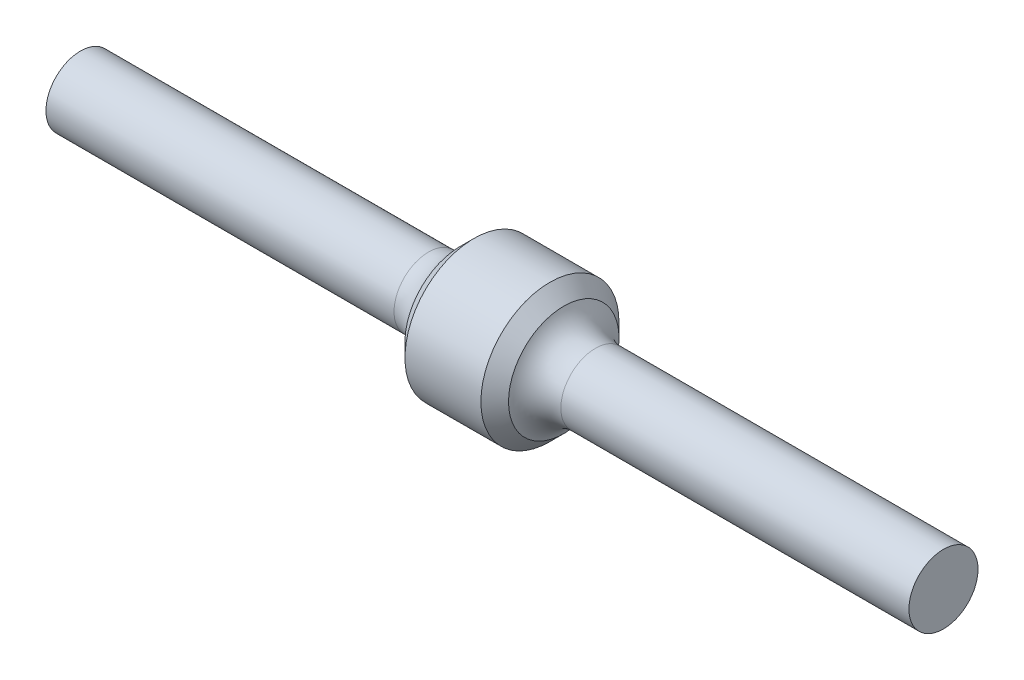
ISO-10303-21;
HEADER;
FILE_DESCRIPTION(('STEP AP214'),'2;1');
FILE_NAME('part.step','',(''),(''),'','','');
FILE_SCHEMA(('AUTOMOTIVE_DESIGN { 1 0 10303 214 1 1 1 1 }'));
ENDSEC;
DATA;
#1=APPLICATION_CONTEXT('core data for automotive mechanical design processes');
#2=APPLICATION_PROTOCOL_DEFINITION('international standard','automotive_design',2000,#1);
#3=PRODUCT_CONTEXT('',#1,'mechanical');
#4=PRODUCT('Part','Part','',(#3));
#5=PRODUCT_RELATED_PRODUCT_CATEGORY('part','',(#4));
#6=PRODUCT_DEFINITION_FORMATION('','',#4);
#7=PRODUCT_DEFINITION_CONTEXT('part definition',#1,'design');
#8=PRODUCT_DEFINITION('design','',#6,#7);
#9=PRODUCT_DEFINITION_SHAPE('','',#8);
#10=(LENGTH_UNIT() NAMED_UNIT(*) SI_UNIT(.MILLI.,.METRE.));
#11=(NAMED_UNIT(*) PLANE_ANGLE_UNIT() SI_UNIT($,.RADIAN.));
#12=(NAMED_UNIT(*) SI_UNIT($,.STERADIAN.) SOLID_ANGLE_UNIT());
#13=UNCERTAINTY_MEASURE_WITH_UNIT(LENGTH_MEASURE(1.E-05),#10,'distance_accuracy_value','');
#14=(GEOMETRIC_REPRESENTATION_CONTEXT(3) GLOBAL_UNCERTAINTY_ASSIGNED_CONTEXT((#13)) GLOBAL_UNIT_ASSIGNED_CONTEXT((#10,
#11,#12)) REPRESENTATION_CONTEXT('',''));
#15=CARTESIAN_POINT('',(0.,0.,0.));
#16=DIRECTION('',(0.,0.,1.));
#17=DIRECTION('',(1.,0.,0.));
#18=AXIS2_PLACEMENT_3D('',#15,#16,#17);
#19=CARTESIAN_POINT('',(-62.5,0.,0.));
#20=DIRECTION('',(1.,0.,0.));
#21=DIRECTION('',(0.,0.,-1.));
#22=AXIS2_PLACEMENT_3D('',#19,#20,#21);
#23=PLANE('',#22);
#24=CARTESIAN_POINT('',(-62.5,0.,0.));
#25=DIRECTION('',(1.,0.,0.));
#26=DIRECTION('',(0.,0.,-1.));
#27=AXIS2_PLACEMENT_3D('',#24,#25,#26);
#28=CIRCLE('',#27,5.);
#29=CARTESIAN_POINT('',(-62.5,0.,-5.));
#30=VERTEX_POINT('',#29);
#31=EDGE_CURVE('E51',#30,#30,#28,.T.);
#32=ORIENTED_EDGE('',*,*,#31,.F.);
#33=EDGE_LOOP('',(#32));
#34=FACE_BOUND('',#33,.T.);
#35=ADVANCED_FACE('F30',(#34),#23,.F.);
#36=CARTESIAN_POINT('',(62.5,0.,0.));
#37=DIRECTION('',(-1.,0.,0.));
#38=DIRECTION('',(0.,0.,1.));
#39=AXIS2_PLACEMENT_3D('',#36,#37,#38);
#40=CYLINDRICAL_SURFACE('',#39,5.);
#41=CARTESIAN_POINT('',(-12.0825756949558,0.,0.));
#42=DIRECTION('',(1.,0.,0.));
#43=DIRECTION('',(0.,0.,-1.));
#44=AXIS2_PLACEMENT_3D('',#41,#42,#43);
#45=CIRCLE('',#44,5.);
#46=CARTESIAN_POINT('',(-12.0825756949558,0.,-5.));
#47=VERTEX_POINT('',#46);
#48=EDGE_CURVE('E45',#47,#47,#45,.F.);
#49=ORIENTED_EDGE('',*,*,#48,.T.);
#50=EDGE_LOOP('',(#49));
#51=FACE_BOUND('',#50,.T.);
#52=ORIENTED_EDGE('',*,*,#31,.T.);
#53=EDGE_LOOP('',(#52));
#54=FACE_BOUND('',#53,.T.);
#55=ADVANCED_FACE('F74',(#51,#54),#40,.T.);
#56=CARTESIAN_POINT('',(-12.0825756949558,0.,0.));
#57=DIRECTION('',(1.,0.,0.));
#58=DIRECTION('',(0.,0.,-1.));
#59=AXIS2_PLACEMENT_3D('',#56,#57,#58);
#60=TOROIDAL_SURFACE('',#59,10.,5.);
#61=ORIENTED_EDGE('',*,*,#48,.F.);
#62=EDGE_LOOP('',(#61));
#63=FACE_BOUND('',#62,.T.);
#64=CARTESIAN_POINT('',(-7.5,0.,0.));
#65=DIRECTION('',(1.,0.,0.));
#66=DIRECTION('',(0.,0.,-1.));
#67=AXIS2_PLACEMENT_3D('',#64,#65,#66);
#68=CIRCLE('',#67,8.);
#69=CARTESIAN_POINT('',(-7.5,0.,-8.));
#70=VERTEX_POINT('',#69);
#71=EDGE_CURVE('E54',#70,#70,#68,.T.);
#72=ORIENTED_EDGE('',*,*,#71,.F.);
#73=EDGE_LOOP('',(#72));
#74=FACE_BOUND('',#73,.T.);
#75=ADVANCED_FACE('F80',(#63,#74),#60,.F.);
#76=CARTESIAN_POINT('',(7.5,0.,0.));
#77=DIRECTION('',(-1.,0.,0.));
#78=DIRECTION('',(0.,0.,1.));
#79=AXIS2_PLACEMENT_3D('',#76,#77,#78);
#80=CYLINDRICAL_SURFACE('',#79,10.);
#81=CARTESIAN_POINT('',(-5.49999999999999,0.,0.));
#82=DIRECTION('',(1.,0.,0.));
#83=DIRECTION('',(0.,0.,-1.));
#84=AXIS2_PLACEMENT_3D('',#81,#82,#83);
#85=CIRCLE('',#84,10.);
#86=CARTESIAN_POINT('',(-5.49999999999999,0.,-10.));
#87=VERTEX_POINT('',#86);
#88=EDGE_CURVE('E10',#87,#87,#85,.T.);
#89=ORIENTED_EDGE('',*,*,#88,.T.);
#90=EDGE_LOOP('',(#89));
#91=FACE_BOUND('',#90,.T.);
#92=CARTESIAN_POINT('',(5.5,0.,0.));
#93=DIRECTION('',(1.,0.,0.));
#94=DIRECTION('',(0.,0.,-1.));
#95=AXIS2_PLACEMENT_3D('',#92,#93,#94);
#96=CIRCLE('',#95,10.);
#97=CARTESIAN_POINT('',(5.5,0.,-10.));
#98=VERTEX_POINT('',#97);
#99=EDGE_CURVE('E37',#98,#98,#96,.F.);
#100=ORIENTED_EDGE('',*,*,#99,.T.);
#101=EDGE_LOOP('',(#100));
#102=FACE_BOUND('',#101,.T.);
#103=ADVANCED_FACE('F93',(#91,#102),#80,.T.);
#104=CARTESIAN_POINT('',(62.5,0.,0.));
#105=DIRECTION('',(1.,0.,0.));
#106=DIRECTION('',(0.,0.,-1.));
#107=AXIS2_PLACEMENT_3D('',#104,#105,#106);
#108=PLANE('',#107);
#109=CARTESIAN_POINT('',(62.5,0.,0.));
#110=DIRECTION('',(1.,0.,0.));
#111=DIRECTION('',(0.,0.,-1.));
#112=AXIS2_PLACEMENT_3D('',#109,#110,#111);
#113=CIRCLE('',#112,5.);
#114=CARTESIAN_POINT('',(62.5,0.,-5.));
#115=VERTEX_POINT('',#114);
#116=EDGE_CURVE('E50',#115,#115,#113,.T.);
#117=ORIENTED_EDGE('',*,*,#116,.T.);
#118=EDGE_LOOP('',(#117));
#119=FACE_BOUND('',#118,.T.);
#120=ADVANCED_FACE('F86',(#119),#108,.T.);
#121=CARTESIAN_POINT('',(12.0825756949558,0.,0.));
#122=DIRECTION('',(-1.,0.,0.));
#123=DIRECTION('',(0.,0.,1.));
#124=AXIS2_PLACEMENT_3D('',#121,#122,#123);
#125=CIRCLE('',#124,5.);
#126=CARTESIAN_POINT('',(12.0825756949558,0.,5.));
#127=VERTEX_POINT('',#126);
#128=EDGE_CURVE('E41',#127,#127,#125,.F.);
#129=ORIENTED_EDGE('',*,*,#128,.T.);
#130=EDGE_LOOP('',(#129));
#131=FACE_BOUND('',#130,.T.);
#132=ORIENTED_EDGE('',*,*,#116,.F.);
#133=EDGE_LOOP('',(#132));
#134=FACE_BOUND('',#133,.T.);
#135=ADVANCED_FACE('F83',(#131,#134),#40,.T.);
#136=CARTESIAN_POINT('',(12.0825756949558,0.,0.));
#137=DIRECTION('',(-1.,0.,0.));
#138=DIRECTION('',(0.,0.,1.));
#139=AXIS2_PLACEMENT_3D('',#136,#137,#138);
#140=TOROIDAL_SURFACE('',#139,10.,5.);
#141=CARTESIAN_POINT('',(7.5,0.,0.));
#142=DIRECTION('',(-1.,0.,0.));
#143=DIRECTION('',(0.,0.,1.));
#144=AXIS2_PLACEMENT_3D('',#141,#142,#143);
#145=CIRCLE('',#144,8.);
#146=CARTESIAN_POINT('',(7.5,0.,8.));
#147=VERTEX_POINT('',#146);
#148=EDGE_CURVE('E59',#147,#147,#145,.F.);
#149=ORIENTED_EDGE('',*,*,#148,.T.);
#150=EDGE_LOOP('',(#149));
#151=FACE_BOUND('',#150,.T.);
#152=ORIENTED_EDGE('',*,*,#128,.F.);
#153=EDGE_LOOP('',(#152));
#154=FACE_BOUND('',#153,.T.);
#155=ADVANCED_FACE('F63',(#151,#154),#140,.F.);
#156=CARTESIAN_POINT('',(-5.49999999999999,0.,0.));
#157=DIRECTION('',(1.,0.,0.));
#158=DIRECTION('',(0.,0.,-1.));
#159=AXIS2_PLACEMENT_3D('',#156,#157,#158);
#160=CONICAL_SURFACE('',#159,10.,0.785398163397447);
#161=ORIENTED_EDGE('',*,*,#71,.T.);
#162=EDGE_LOOP('',(#161));
#163=FACE_BOUND('',#162,.T.);
#164=ORIENTED_EDGE('',*,*,#88,.F.);
#165=EDGE_LOOP('',(#164));
#166=FACE_BOUND('',#165,.T.);
#167=ADVANCED_FACE('F67',(#163,#166),#160,.T.);
#168=CARTESIAN_POINT('',(7.5,0.,0.));
#169=DIRECTION('',(-1.,0.,0.));
#170=DIRECTION('',(0.,0.,1.));
#171=AXIS2_PLACEMENT_3D('',#168,#169,#170);
#172=CONICAL_SURFACE('',#171,7.99999999999999,0.78539816339745);
#173=ORIENTED_EDGE('',*,*,#99,.F.);
#174=EDGE_LOOP('',(#173));
#175=FACE_BOUND('',#174,.T.);
#176=ORIENTED_EDGE('',*,*,#148,.F.);
#177=EDGE_LOOP('',(#176));
#178=FACE_BOUND('',#177,.T.);
#179=ADVANCED_FACE('F32',(#175,#178),#172,.T.);
#180=CLOSED_SHELL('',(#35,#55,#75,#103,#120,#135,#155,#167,#179));
#181=MANIFOLD_SOLID_BREP('B2',#180);
#182=ADVANCED_BREP_SHAPE_REPRESENTATION('',(#18,#181),#14);
#183=SHAPE_DEFINITION_REPRESENTATION(#9,#182);
ENDSEC;
END-ISO-10303-21;
